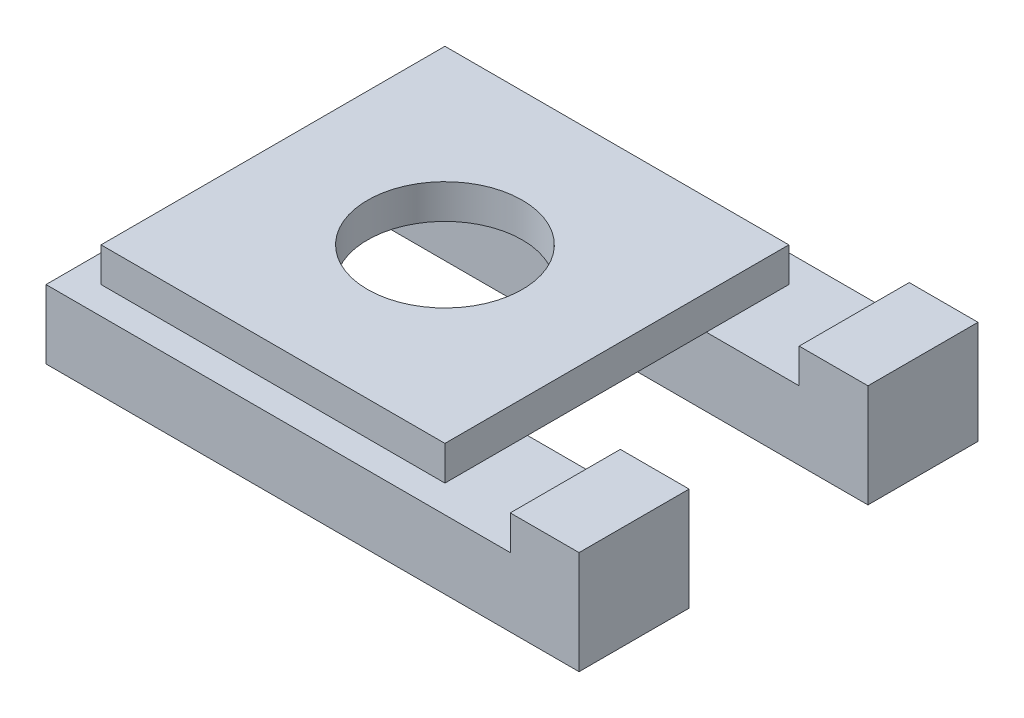
ISO-10303-21;
HEADER;
FILE_DESCRIPTION(('STEP AP214'),'2;1');
FILE_NAME('part.step','',(''),(''),'','','');
FILE_SCHEMA(('AUTOMOTIVE_DESIGN { 1 0 10303 214 1 1 1 1 }'));
ENDSEC;
DATA;
#1=APPLICATION_CONTEXT('core data for automotive mechanical design processes');
#2=APPLICATION_PROTOCOL_DEFINITION('international standard','automotive_design',2000,#1);
#3=PRODUCT_CONTEXT('',#1,'mechanical');
#4=PRODUCT('Part','Part','',(#3));
#5=PRODUCT_RELATED_PRODUCT_CATEGORY('part','',(#4));
#6=PRODUCT_DEFINITION_FORMATION('','',#4);
#7=PRODUCT_DEFINITION_CONTEXT('part definition',#1,'design');
#8=PRODUCT_DEFINITION('design','',#6,#7);
#9=PRODUCT_DEFINITION_SHAPE('','',#8);
#10=(LENGTH_UNIT() NAMED_UNIT(*) SI_UNIT(.MILLI.,.METRE.));
#11=(NAMED_UNIT(*) PLANE_ANGLE_UNIT() SI_UNIT($,.RADIAN.));
#12=(NAMED_UNIT(*) SI_UNIT($,.STERADIAN.) SOLID_ANGLE_UNIT());
#13=UNCERTAINTY_MEASURE_WITH_UNIT(LENGTH_MEASURE(1.E-05),#10,'distance_accuracy_value','');
#14=(GEOMETRIC_REPRESENTATION_CONTEXT(3) GLOBAL_UNCERTAINTY_ASSIGNED_CONTEXT((#13)) GLOBAL_UNIT_ASSIGNED_CONTEXT((#10,
#11,#12)) REPRESENTATION_CONTEXT('',''));
#15=CARTESIAN_POINT('',(0.,0.,0.));
#16=DIRECTION('',(0.,0.,1.));
#17=DIRECTION('',(1.,0.,0.));
#18=AXIS2_PLACEMENT_3D('',#15,#16,#17);
#19=CARTESIAN_POINT('',(0.,0.,0.));
#20=DIRECTION('',(0.,-1.,0.));
#21=DIRECTION('',(0.,0.,-1.));
#22=AXIS2_PLACEMENT_3D('',#19,#20,#21);
#23=PLANE('',#22);
#24=DIRECTION('',(0.,0.,1.));
#25=VECTOR('',#24,1.);
#26=CARTESIAN_POINT('',(77.,0.,0.));
#27=LINE('',#26,#25);
#28=CARTESIAN_POINT('',(77.,0.,-58.));
#29=VERTEX_POINT('',#28);
#30=CARTESIAN_POINT('',(77.,0.,-26.));
#31=VERTEX_POINT('',#30);
#32=EDGE_CURVE('E66',#29,#31,#27,.T.);
#33=ORIENTED_EDGE('',*,*,#32,.F.);
#34=DIRECTION('',(1.,0.,0.));
#35=VECTOR('',#34,1.);
#36=CARTESIAN_POINT('',(0.,0.,-58.));
#37=LINE('',#36,#35);
#38=CARTESIAN_POINT('',(-58.,0.,-58.));
#39=VERTEX_POINT('',#38);
#40=EDGE_CURVE('E251',#39,#29,#37,.T.);
#41=ORIENTED_EDGE('',*,*,#40,.F.);
#42=DIRECTION('',(0.,0.,1.));
#43=VECTOR('',#42,1.);
#44=CARTESIAN_POINT('',(-58.,0.,0.));
#45=LINE('',#44,#43);
#46=CARTESIAN_POINT('',(-58.,0.,-26.));
#47=VERTEX_POINT('',#46);
#48=EDGE_CURVE('E262',#39,#47,#45,.T.);
#49=ORIENTED_EDGE('',*,*,#48,.T.);
#50=DIRECTION('',(1.,0.,0.));
#51=VECTOR('',#50,1.);
#52=CARTESIAN_POINT('',(0.,0.,-26.));
#53=LINE('',#52,#51);
#54=CARTESIAN_POINT('',(-50.,0.,-26.));
#55=VERTEX_POINT('',#54);
#56=EDGE_CURVE('E261',#47,#55,#53,.T.);
#57=ORIENTED_EDGE('',*,*,#56,.T.);
#58=DIRECTION('',(0.,0.,1.));
#59=VECTOR('',#58,1.);
#60=CARTESIAN_POINT('',(-50.,0.,50.));
#61=LINE('',#60,#59);
#62=CARTESIAN_POINT('',(-50.,0.,-50.));
#63=VERTEX_POINT('',#62);
#64=EDGE_CURVE('E297',#63,#55,#61,.T.);
#65=ORIENTED_EDGE('',*,*,#64,.F.);
#66=DIRECTION('',(-1.,0.,0.));
#67=VECTOR('',#66,1.);
#68=CARTESIAN_POINT('',(-50.,0.,-50.));
#69=LINE('',#68,#67);
#70=CARTESIAN_POINT('',(50.,0.,-50.));
#71=VERTEX_POINT('',#70);
#72=EDGE_CURVE('E291',#71,#63,#69,.T.);
#73=ORIENTED_EDGE('',*,*,#72,.F.);
#74=DIRECTION('',(0.,0.,-1.));
#75=VECTOR('',#74,1.);
#76=CARTESIAN_POINT('',(50.,0.,50.));
#77=LINE('',#76,#75);
#78=CARTESIAN_POINT('',(50.,0.,-26.));
#79=VERTEX_POINT('',#78);
#80=EDGE_CURVE('E280',#79,#71,#77,.T.);
#81=ORIENTED_EDGE('',*,*,#80,.F.);
#82=EDGE_CURVE('E210',#79,#31,#53,.T.);
#83=ORIENTED_EDGE('',*,*,#82,.T.);
#84=EDGE_LOOP('',(#33,#41,#49,#57,#65,#73,#81,#83));
#85=FACE_BOUND('',#84,.T.);
#86=ADVANCED_FACE('F41',(#85),#23,.F.);
#87=CARTESIAN_POINT('',(0.,0.,0.));
#88=DIRECTION('',(0.,-1.,0.));
#89=DIRECTION('',(0.,0.,-1.));
#90=AXIS2_PLACEMENT_3D('',#87,#88,#89);
#91=PLANE('',#90);
#92=DIRECTION('',(1.,0.,0.));
#93=VECTOR('',#92,1.);
#94=CARTESIAN_POINT('',(0.,0.,26.));
#95=LINE('',#94,#93);
#96=CARTESIAN_POINT('',(-50.,0.,26.));
#97=VERTEX_POINT('',#96);
#98=CARTESIAN_POINT('',(50.,0.,26.));
#99=VERTEX_POINT('',#98);
#100=EDGE_CURVE('E11',#97,#99,#95,.T.);
#101=ORIENTED_EDGE('',*,*,#100,.F.);
#102=EDGE_CURVE('E303',#55,#97,#61,.T.);
#103=ORIENTED_EDGE('',*,*,#102,.F.);
#104=EDGE_CURVE('E49',#55,#79,#53,.T.);
#105=ORIENTED_EDGE('',*,*,#104,.T.);
#106=EDGE_CURVE('E294',#99,#79,#77,.T.);
#107=ORIENTED_EDGE('',*,*,#106,.F.);
#108=EDGE_LOOP('',(#101,#103,#105,#107));
#109=FACE_BOUND('',#108,.T.);
#110=CARTESIAN_POINT('',(0.,0.,0.));
#111=DIRECTION('',(0.,1.,0.));
#112=DIRECTION('',(0.,0.,1.));
#113=AXIS2_PLACEMENT_3D('',#110,#111,#112);
#114=CIRCLE('',#113,22.5);
#115=CARTESIAN_POINT('',(0.,0.,22.5));
#116=VERTEX_POINT('',#115);
#117=EDGE_CURVE('E246',#116,#116,#114,.T.);
#118=ORIENTED_EDGE('',*,*,#117,.T.);
#119=EDGE_LOOP('',(#118));
#120=FACE_BOUND('',#119,.T.);
#121=ADVANCED_FACE('F336',(#109,#120),#91,.T.);
#122=CARTESIAN_POINT('',(0.,10.,0.));
#123=DIRECTION('',(0.,-1.,0.));
#124=DIRECTION('',(0.,0.,-1.));
#125=AXIS2_PLACEMENT_3D('',#122,#123,#124);
#126=PLANE('',#125);
#127=DIRECTION('',(0.,0.,-1.));
#128=VECTOR('',#127,1.);
#129=CARTESIAN_POINT('',(50.,10.,50.));
#130=LINE('',#129,#128);
#131=CARTESIAN_POINT('',(50.,10.,50.));
#132=VERTEX_POINT('',#131);
#133=CARTESIAN_POINT('',(50.,10.,-50.));
#134=VERTEX_POINT('',#133);
#135=EDGE_CURVE('E278',#132,#134,#130,.T.);
#136=ORIENTED_EDGE('',*,*,#135,.T.);
#137=DIRECTION('',(-1.,0.,0.));
#138=VECTOR('',#137,1.);
#139=CARTESIAN_POINT('',(-50.,10.,-50.));
#140=LINE('',#139,#138);
#141=CARTESIAN_POINT('',(-50.,10.,-50.));
#142=VERTEX_POINT('',#141);
#143=EDGE_CURVE('E282',#134,#142,#140,.T.);
#144=ORIENTED_EDGE('',*,*,#143,.T.);
#145=DIRECTION('',(0.,0.,1.));
#146=VECTOR('',#145,1.);
#147=CARTESIAN_POINT('',(-50.,10.,50.));
#148=LINE('',#147,#146);
#149=CARTESIAN_POINT('',(-50.,10.,50.));
#150=VERTEX_POINT('',#149);
#151=EDGE_CURVE('E288',#142,#150,#148,.T.);
#152=ORIENTED_EDGE('',*,*,#151,.T.);
#153=DIRECTION('',(1.,0.,0.));
#154=VECTOR('',#153,1.);
#155=CARTESIAN_POINT('',(-50.,10.,50.));
#156=LINE('',#155,#154);
#157=EDGE_CURVE('E286',#150,#132,#156,.T.);
#158=ORIENTED_EDGE('',*,*,#157,.T.);
#159=EDGE_LOOP('',(#136,#144,#152,#158));
#160=FACE_BOUND('',#159,.T.);
#161=CARTESIAN_POINT('',(0.,10.,0.));
#162=DIRECTION('',(0.,1.,0.));
#163=DIRECTION('',(0.,0.,1.));
#164=AXIS2_PLACEMENT_3D('',#161,#162,#163);
#165=CIRCLE('',#164,22.5);
#166=CARTESIAN_POINT('',(0.,10.,22.5));
#167=VERTEX_POINT('',#166);
#168=EDGE_CURVE('E273',#167,#167,#165,.T.);
#169=ORIENTED_EDGE('',*,*,#168,.F.);
#170=EDGE_LOOP('',(#169));
#171=FACE_BOUND('',#170,.T.);
#172=ADVANCED_FACE('F362',(#160,#171),#126,.F.);
#173=CARTESIAN_POINT('',(50.,10.,50.));
#174=DIRECTION('',(-1.,0.,0.));
#175=DIRECTION('',(0.,0.,1.));
#176=AXIS2_PLACEMENT_3D('',#173,#174,#175);
#177=PLANE('',#176);
#178=CARTESIAN_POINT('',(50.,0.,50.));
#179=VERTEX_POINT('',#178);
#180=EDGE_CURVE('E292',#179,#99,#77,.T.);
#181=ORIENTED_EDGE('',*,*,#180,.T.);
#182=ORIENTED_EDGE('',*,*,#106,.T.);
#183=ORIENTED_EDGE('',*,*,#80,.T.);
#184=DIRECTION('',(0.,-1.,0.));
#185=VECTOR('',#184,1.);
#186=CARTESIAN_POINT('',(50.,10.,-50.));
#187=LINE('',#186,#185);
#188=EDGE_CURVE('E44',#134,#71,#187,.T.);
#189=ORIENTED_EDGE('',*,*,#188,.F.);
#190=ORIENTED_EDGE('',*,*,#135,.F.);
#191=DIRECTION('',(0.,-1.,0.));
#192=VECTOR('',#191,1.);
#193=CARTESIAN_POINT('',(50.,10.,50.));
#194=LINE('',#193,#192);
#195=EDGE_CURVE('E289',#132,#179,#194,.T.);
#196=ORIENTED_EDGE('',*,*,#195,.T.);
#197=EDGE_LOOP('',(#181,#182,#183,#189,#190,#196));
#198=FACE_BOUND('',#197,.T.);
#199=ADVANCED_FACE('F43',(#198),#177,.F.);
#200=CARTESIAN_POINT('',(-50.,10.,-50.));
#201=DIRECTION('',(0.,0.,1.));
#202=DIRECTION('',(1.,0.,0.));
#203=AXIS2_PLACEMENT_3D('',#200,#201,#202);
#204=PLANE('',#203);
#205=ORIENTED_EDGE('',*,*,#72,.T.);
#206=DIRECTION('',(0.,-1.,0.));
#207=VECTOR('',#206,1.);
#208=CARTESIAN_POINT('',(-50.,10.,-50.));
#209=LINE('',#208,#207);
#210=EDGE_CURVE('E307',#142,#63,#209,.T.);
#211=ORIENTED_EDGE('',*,*,#210,.F.);
#212=ORIENTED_EDGE('',*,*,#143,.F.);
#213=ORIENTED_EDGE('',*,*,#188,.T.);
#214=EDGE_LOOP('',(#205,#211,#212,#213));
#215=FACE_BOUND('',#214,.T.);
#216=ADVANCED_FACE('F347',(#215),#204,.F.);
#217=CARTESIAN_POINT('',(-50.,10.,50.));
#218=DIRECTION('',(1.,0.,0.));
#219=DIRECTION('',(0.,0.,-1.));
#220=AXIS2_PLACEMENT_3D('',#217,#218,#219);
#221=PLANE('',#220);
#222=ORIENTED_EDGE('',*,*,#64,.T.);
#223=ORIENTED_EDGE('',*,*,#102,.T.);
#224=CARTESIAN_POINT('',(-50.,0.,50.));
#225=VERTEX_POINT('',#224);
#226=EDGE_CURVE('E299',#97,#225,#61,.T.);
#227=ORIENTED_EDGE('',*,*,#226,.T.);
#228=DIRECTION('',(0.,-1.,0.));
#229=VECTOR('',#228,1.);
#230=CARTESIAN_POINT('',(-50.,10.,50.));
#231=LINE('',#230,#229);
#232=EDGE_CURVE('E304',#150,#225,#231,.T.);
#233=ORIENTED_EDGE('',*,*,#232,.F.);
#234=ORIENTED_EDGE('',*,*,#151,.F.);
#235=ORIENTED_EDGE('',*,*,#210,.T.);
#236=EDGE_LOOP('',(#222,#223,#227,#233,#234,#235));
#237=FACE_BOUND('',#236,.T.);
#238=ADVANCED_FACE('F341',(#237),#221,.F.);
#239=CARTESIAN_POINT('',(-50.,10.,50.));
#240=DIRECTION('',(0.,0.,-1.));
#241=DIRECTION('',(-1.,0.,0.));
#242=AXIS2_PLACEMENT_3D('',#239,#240,#241);
#243=PLANE('',#242);
#244=DIRECTION('',(1.,0.,0.));
#245=VECTOR('',#244,1.);
#246=CARTESIAN_POINT('',(-50.,0.,50.));
#247=LINE('',#246,#245);
#248=EDGE_CURVE('E285',#225,#179,#247,.T.);
#249=ORIENTED_EDGE('',*,*,#248,.T.);
#250=ORIENTED_EDGE('',*,*,#195,.F.);
#251=ORIENTED_EDGE('',*,*,#157,.F.);
#252=ORIENTED_EDGE('',*,*,#232,.T.);
#253=EDGE_LOOP('',(#249,#250,#251,#252));
#254=FACE_BOUND('',#253,.T.);
#255=ADVANCED_FACE('F344',(#254),#243,.F.);
#256=CARTESIAN_POINT('',(0.,10.,0.));
#257=DIRECTION('',(0.,-1.,0.));
#258=DIRECTION('',(0.,0.,-1.));
#259=AXIS2_PLACEMENT_3D('',#256,#257,#258);
#260=CYLINDRICAL_SURFACE('',#259,22.5);
#261=ORIENTED_EDGE('',*,*,#168,.T.);
#262=EDGE_LOOP('',(#261));
#263=FACE_BOUND('',#262,.T.);
#264=ORIENTED_EDGE('',*,*,#117,.F.);
#265=EDGE_LOOP('',(#264));
#266=FACE_BOUND('',#265,.T.);
#267=ADVANCED_FACE('F354',(#263,#266),#260,.F.);
#268=CARTESIAN_POINT('',(0.,-20.,-26.));
#269=DIRECTION('',(0.,0.,1.));
#270=DIRECTION('',(1.,0.,0.));
#271=AXIS2_PLACEMENT_3D('',#268,#269,#270);
#272=PLANE('',#271);
#273=ORIENTED_EDGE('',*,*,#56,.F.);
#274=DIRECTION('',(0.,1.,0.));
#275=VECTOR('',#274,1.);
#276=CARTESIAN_POINT('',(-58.,-20.,-26.));
#277=LINE('',#276,#275);
#278=CARTESIAN_POINT('',(-58.,-20.,-26.));
#279=VERTEX_POINT('',#278);
#280=EDGE_CURVE('E236',#279,#47,#277,.T.);
#281=ORIENTED_EDGE('',*,*,#280,.F.);
#282=DIRECTION('',(1.,0.,0.));
#283=VECTOR('',#282,1.);
#284=CARTESIAN_POINT('',(0.,-20.,-26.));
#285=LINE('',#284,#283);
#286=CARTESIAN_POINT('',(97.,-20.,-26.));
#287=VERTEX_POINT('',#286);
#288=EDGE_CURVE('E247',#279,#287,#285,.T.);
#289=ORIENTED_EDGE('',*,*,#288,.T.);
#290=DIRECTION('',(0.,1.,0.));
#291=VECTOR('',#290,1.);
#292=CARTESIAN_POINT('',(97.,-20.,-26.));
#293=LINE('',#292,#291);
#294=CARTESIAN_POINT('',(97.,10.,-26.));
#295=VERTEX_POINT('',#294);
#296=EDGE_CURVE('E257',#287,#295,#293,.T.);
#297=ORIENTED_EDGE('',*,*,#296,.T.);
#298=DIRECTION('',(1.,0.,0.));
#299=VECTOR('',#298,1.);
#300=CARTESIAN_POINT('',(0.,10.,-26.));
#301=LINE('',#300,#299);
#302=CARTESIAN_POINT('',(77.,10.,-26.));
#303=VERTEX_POINT('',#302);
#304=EDGE_CURVE('E217',#303,#295,#301,.T.);
#305=ORIENTED_EDGE('',*,*,#304,.F.);
#306=DIRECTION('',(0.,-1.,0.));
#307=VECTOR('',#306,1.);
#308=CARTESIAN_POINT('',(77.,10.,-26.));
#309=LINE('',#308,#307);
#310=EDGE_CURVE('E200',#303,#31,#309,.T.);
#311=ORIENTED_EDGE('',*,*,#310,.T.);
#312=ORIENTED_EDGE('',*,*,#82,.F.);
#313=ORIENTED_EDGE('',*,*,#104,.F.);
#314=EDGE_LOOP('',(#273,#281,#289,#297,#305,#311,#312,#313));
#315=FACE_BOUND('',#314,.T.);
#316=ADVANCED_FACE('F324',(#315),#272,.T.);
#317=CARTESIAN_POINT('',(-58.,-20.,0.));
#318=DIRECTION('',(-1.,0.,0.));
#319=DIRECTION('',(0.,0.,1.));
#320=AXIS2_PLACEMENT_3D('',#317,#318,#319);
#321=PLANE('',#320);
#322=ORIENTED_EDGE('',*,*,#48,.F.);
#323=DIRECTION('',(0.,1.,0.));
#324=VECTOR('',#323,1.);
#325=CARTESIAN_POINT('',(-58.,-20.,-58.));
#326=LINE('',#325,#324);
#327=CARTESIAN_POINT('',(-58.,-20.,-58.));
#328=VERTEX_POINT('',#327);
#329=EDGE_CURVE('E271',#328,#39,#326,.T.);
#330=ORIENTED_EDGE('',*,*,#329,.F.);
#331=DIRECTION('',(0.,0.,1.));
#332=VECTOR('',#331,1.);
#333=CARTESIAN_POINT('',(-58.,-20.,0.));
#334=LINE('',#333,#332);
#335=EDGE_CURVE('E252',#328,#279,#334,.T.);
#336=ORIENTED_EDGE('',*,*,#335,.T.);
#337=ORIENTED_EDGE('',*,*,#280,.T.);
#338=EDGE_LOOP('',(#322,#330,#336,#337));
#339=FACE_BOUND('',#338,.T.);
#340=ADVANCED_FACE('F338',(#339),#321,.T.);
#341=CARTESIAN_POINT('',(0.,-20.,-58.));
#342=DIRECTION('',(0.,0.,1.));
#343=DIRECTION('',(1.,0.,0.));
#344=AXIS2_PLACEMENT_3D('',#341,#342,#343);
#345=PLANE('',#344);
#346=ORIENTED_EDGE('',*,*,#40,.T.);
#347=DIRECTION('',(0.,-1.,0.));
#348=VECTOR('',#347,1.);
#349=CARTESIAN_POINT('',(77.,10.,-58.));
#350=LINE('',#349,#348);
#351=CARTESIAN_POINT('',(77.,10.,-58.));
#352=VERTEX_POINT('',#351);
#353=EDGE_CURVE('E222',#352,#29,#350,.T.);
#354=ORIENTED_EDGE('',*,*,#353,.F.);
#355=DIRECTION('',(1.,0.,0.));
#356=VECTOR('',#355,1.);
#357=CARTESIAN_POINT('',(0.,10.,-58.));
#358=LINE('',#357,#356);
#359=CARTESIAN_POINT('',(97.,10.,-58.));
#360=VERTEX_POINT('',#359);
#361=EDGE_CURVE('E215',#352,#360,#358,.T.);
#362=ORIENTED_EDGE('',*,*,#361,.T.);
#363=DIRECTION('',(0.,1.,0.));
#364=VECTOR('',#363,1.);
#365=CARTESIAN_POINT('',(97.,-20.,-58.));
#366=LINE('',#365,#364);
#367=CARTESIAN_POINT('',(97.,-20.,-58.));
#368=VERTEX_POINT('',#367);
#369=EDGE_CURVE('E267',#368,#360,#366,.T.);
#370=ORIENTED_EDGE('',*,*,#369,.F.);
#371=DIRECTION('',(1.,0.,0.));
#372=VECTOR('',#371,1.);
#373=CARTESIAN_POINT('',(0.,-20.,-58.));
#374=LINE('',#373,#372);
#375=EDGE_CURVE('E258',#328,#368,#374,.T.);
#376=ORIENTED_EDGE('',*,*,#375,.F.);
#377=ORIENTED_EDGE('',*,*,#329,.T.);
#378=EDGE_LOOP('',(#346,#354,#362,#370,#376,#377));
#379=FACE_BOUND('',#378,.T.);
#380=ADVANCED_FACE('F332',(#379),#345,.F.);
#381=CARTESIAN_POINT('',(97.,-20.,0.));
#382=DIRECTION('',(-1.,0.,0.));
#383=DIRECTION('',(0.,0.,1.));
#384=AXIS2_PLACEMENT_3D('',#381,#382,#383);
#385=PLANE('',#384);
#386=ORIENTED_EDGE('',*,*,#369,.T.);
#387=DIRECTION('',(0.,0.,1.));
#388=VECTOR('',#387,1.);
#389=CARTESIAN_POINT('',(97.,10.,0.));
#390=LINE('',#389,#388);
#391=EDGE_CURVE('E214',#360,#295,#390,.T.);
#392=ORIENTED_EDGE('',*,*,#391,.T.);
#393=ORIENTED_EDGE('',*,*,#296,.F.);
#394=DIRECTION('',(0.,0.,1.));
#395=VECTOR('',#394,1.);
#396=CARTESIAN_POINT('',(97.,-20.,0.));
#397=LINE('',#396,#395);
#398=EDGE_CURVE('E256',#368,#287,#397,.T.);
#399=ORIENTED_EDGE('',*,*,#398,.F.);
#400=EDGE_LOOP('',(#386,#392,#393,#399));
#401=FACE_BOUND('',#400,.T.);
#402=ADVANCED_FACE('F366',(#401),#385,.F.);
#403=CARTESIAN_POINT('',(0.,-20.,0.));
#404=DIRECTION('',(0.,-1.,0.));
#405=DIRECTION('',(0.,0.,-1.));
#406=AXIS2_PLACEMENT_3D('',#403,#404,#405);
#407=PLANE('',#406);
#408=ORIENTED_EDGE('',*,*,#288,.F.);
#409=ORIENTED_EDGE('',*,*,#335,.F.);
#410=ORIENTED_EDGE('',*,*,#375,.T.);
#411=ORIENTED_EDGE('',*,*,#398,.T.);
#412=EDGE_LOOP('',(#408,#409,#410,#411));
#413=FACE_BOUND('',#412,.T.);
#414=ADVANCED_FACE('F368',(#413),#407,.T.);
#415=CARTESIAN_POINT('',(-58.,-20.,0.));
#416=DIRECTION('',(1.,0.,0.));
#417=DIRECTION('',(0.,0.,-1.));
#418=AXIS2_PLACEMENT_3D('',#415,#416,#417);
#419=PLANE('',#418);
#420=DIRECTION('',(0.,0.,-1.));
#421=VECTOR('',#420,1.);
#422=CARTESIAN_POINT('',(-58.,0.,0.));
#423=LINE('',#422,#421);
#424=CARTESIAN_POINT('',(-58.,0.,58.));
#425=VERTEX_POINT('',#424);
#426=CARTESIAN_POINT('',(-58.,0.,26.));
#427=VERTEX_POINT('',#426);
#428=EDGE_CURVE('E237',#425,#427,#423,.T.);
#429=ORIENTED_EDGE('',*,*,#428,.T.);
#430=DIRECTION('',(0.,1.,0.));
#431=VECTOR('',#430,1.);
#432=CARTESIAN_POINT('',(-58.,-20.,26.));
#433=LINE('',#432,#431);
#434=CARTESIAN_POINT('',(-58.,-20.,26.));
#435=VERTEX_POINT('',#434);
#436=EDGE_CURVE('E241',#435,#427,#433,.T.);
#437=ORIENTED_EDGE('',*,*,#436,.F.);
#438=DIRECTION('',(0.,0.,-1.));
#439=VECTOR('',#438,1.);
#440=CARTESIAN_POINT('',(-58.,-20.,0.));
#441=LINE('',#440,#439);
#442=CARTESIAN_POINT('',(-58.,-20.,58.));
#443=VERTEX_POINT('',#442);
#444=EDGE_CURVE('E229',#443,#435,#441,.T.);
#445=ORIENTED_EDGE('',*,*,#444,.F.);
#446=DIRECTION('',(0.,1.,0.));
#447=VECTOR('',#446,1.);
#448=CARTESIAN_POINT('',(-58.,-20.,58.));
#449=LINE('',#448,#447);
#450=EDGE_CURVE('E183',#443,#425,#449,.T.);
#451=ORIENTED_EDGE('',*,*,#450,.T.);
#452=EDGE_LOOP('',(#429,#437,#445,#451));
#453=FACE_BOUND('',#452,.T.);
#454=ADVANCED_FACE('F429',(#453),#419,.F.);
#455=CARTESIAN_POINT('',(0.,-20.,26.));
#456=DIRECTION('',(0.,0.,1.));
#457=DIRECTION('',(1.,0.,0.));
#458=AXIS2_PLACEMENT_3D('',#455,#456,#457);
#459=PLANE('',#458);
#460=EDGE_CURVE('E55',#427,#97,#95,.T.);
#461=ORIENTED_EDGE('',*,*,#460,.T.);
#462=ORIENTED_EDGE('',*,*,#100,.T.);
#463=CARTESIAN_POINT('',(77.,0.,26.));
#464=VERTEX_POINT('',#463);
#465=EDGE_CURVE('E52',#99,#464,#95,.T.);
#466=ORIENTED_EDGE('',*,*,#465,.T.);
#467=DIRECTION('',(0.,-1.,0.));
#468=VECTOR('',#467,1.);
#469=CARTESIAN_POINT('',(77.,10.,26.));
#470=LINE('',#469,#468);
#471=CARTESIAN_POINT('',(77.,10.,26.));
#472=VERTEX_POINT('',#471);
#473=EDGE_CURVE('E58',#472,#464,#470,.T.);
#474=ORIENTED_EDGE('',*,*,#473,.F.);
#475=DIRECTION('',(1.,0.,0.));
#476=VECTOR('',#475,1.);
#477=CARTESIAN_POINT('',(0.,10.,26.));
#478=LINE('',#477,#476);
#479=CARTESIAN_POINT('',(97.,10.,26.));
#480=VERTEX_POINT('',#479);
#481=EDGE_CURVE('E201',#472,#480,#478,.T.);
#482=ORIENTED_EDGE('',*,*,#481,.T.);
#483=DIRECTION('',(0.,1.,0.));
#484=VECTOR('',#483,1.);
#485=CARTESIAN_POINT('',(97.,-20.,26.));
#486=LINE('',#485,#484);
#487=CARTESIAN_POINT('',(97.,-20.,26.));
#488=VERTEX_POINT('',#487);
#489=EDGE_CURVE('E184',#488,#480,#486,.T.);
#490=ORIENTED_EDGE('',*,*,#489,.F.);
#491=DIRECTION('',(1.,0.,0.));
#492=VECTOR('',#491,1.);
#493=CARTESIAN_POINT('',(0.,-20.,26.));
#494=LINE('',#493,#492);
#495=EDGE_CURVE('E226',#435,#488,#494,.T.);
#496=ORIENTED_EDGE('',*,*,#495,.F.);
#497=ORIENTED_EDGE('',*,*,#436,.T.);
#498=EDGE_LOOP('',(#461,#462,#466,#474,#482,#490,#496,#497));
#499=FACE_BOUND('',#498,.T.);
#500=ADVANCED_FACE('F399',(#499),#459,.F.);
#501=CARTESIAN_POINT('',(97.,-20.,0.));
#502=DIRECTION('',(1.,0.,0.));
#503=DIRECTION('',(0.,0.,-1.));
#504=AXIS2_PLACEMENT_3D('',#501,#502,#503);
#505=PLANE('',#504);
#506=ORIENTED_EDGE('',*,*,#489,.T.);
#507=DIRECTION('',(0.,0.,-1.));
#508=VECTOR('',#507,1.);
#509=CARTESIAN_POINT('',(97.,10.,0.));
#510=LINE('',#509,#508);
#511=CARTESIAN_POINT('',(97.,10.,58.));
#512=VERTEX_POINT('',#511);
#513=EDGE_CURVE('E193',#512,#480,#510,.T.);
#514=ORIENTED_EDGE('',*,*,#513,.F.);
#515=DIRECTION('',(0.,1.,0.));
#516=VECTOR('',#515,1.);
#517=CARTESIAN_POINT('',(97.,-20.,58.));
#518=LINE('',#517,#516);
#519=CARTESIAN_POINT('',(97.,-20.,58.));
#520=VERTEX_POINT('',#519);
#521=EDGE_CURVE('E174',#520,#512,#518,.T.);
#522=ORIENTED_EDGE('',*,*,#521,.F.);
#523=DIRECTION('',(0.,0.,-1.));
#524=VECTOR('',#523,1.);
#525=CARTESIAN_POINT('',(97.,-20.,0.));
#526=LINE('',#525,#524);
#527=EDGE_CURVE('E231',#520,#488,#526,.T.);
#528=ORIENTED_EDGE('',*,*,#527,.T.);
#529=EDGE_LOOP('',(#506,#514,#522,#528));
#530=FACE_BOUND('',#529,.T.);
#531=ADVANCED_FACE('F194',(#530),#505,.T.);
#532=CARTESIAN_POINT('',(0.,-20.,58.));
#533=DIRECTION('',(0.,0.,1.));
#534=DIRECTION('',(1.,0.,0.));
#535=AXIS2_PLACEMENT_3D('',#532,#533,#534);
#536=PLANE('',#535);
#537=DIRECTION('',(1.,0.,0.));
#538=VECTOR('',#537,1.);
#539=CARTESIAN_POINT('',(0.,0.,58.));
#540=LINE('',#539,#538);
#541=CARTESIAN_POINT('',(77.,0.,58.));
#542=VERTEX_POINT('',#541);
#543=EDGE_CURVE('E233',#425,#542,#540,.T.);
#544=ORIENTED_EDGE('',*,*,#543,.F.);
#545=ORIENTED_EDGE('',*,*,#450,.F.);
#546=DIRECTION('',(1.,0.,0.));
#547=VECTOR('',#546,1.);
#548=CARTESIAN_POINT('',(0.,-20.,58.));
#549=LINE('',#548,#547);
#550=EDGE_CURVE('E177',#443,#520,#549,.T.);
#551=ORIENTED_EDGE('',*,*,#550,.T.);
#552=ORIENTED_EDGE('',*,*,#521,.T.);
#553=DIRECTION('',(1.,0.,0.));
#554=VECTOR('',#553,1.);
#555=CARTESIAN_POINT('',(0.,10.,58.));
#556=LINE('',#555,#554);
#557=CARTESIAN_POINT('',(77.,10.,58.));
#558=VERTEX_POINT('',#557);
#559=EDGE_CURVE('E178',#558,#512,#556,.T.);
#560=ORIENTED_EDGE('',*,*,#559,.F.);
#561=DIRECTION('',(0.,-1.,0.));
#562=VECTOR('',#561,1.);
#563=CARTESIAN_POINT('',(77.,10.,58.));
#564=LINE('',#563,#562);
#565=EDGE_CURVE('E204',#558,#542,#564,.T.);
#566=ORIENTED_EDGE('',*,*,#565,.T.);
#567=EDGE_LOOP('',(#544,#545,#551,#552,#560,#566));
#568=FACE_BOUND('',#567,.T.);
#569=ADVANCED_FACE('F171',(#568),#536,.T.);
#570=CARTESIAN_POINT('',(0.,-20.,0.));
#571=DIRECTION('',(0.,-1.,0.));
#572=DIRECTION('',(0.,0.,-1.));
#573=AXIS2_PLACEMENT_3D('',#570,#571,#572);
#574=PLANE('',#573);
#575=ORIENTED_EDGE('',*,*,#444,.T.);
#576=ORIENTED_EDGE('',*,*,#495,.T.);
#577=ORIENTED_EDGE('',*,*,#527,.F.);
#578=ORIENTED_EDGE('',*,*,#550,.F.);
#579=EDGE_LOOP('',(#575,#576,#577,#578));
#580=FACE_BOUND('',#579,.T.);
#581=ADVANCED_FACE('F412',(#580),#574,.T.);
#582=CARTESIAN_POINT('',(0.,0.,0.));
#583=DIRECTION('',(0.,-1.,0.));
#584=DIRECTION('',(0.,0.,-1.));
#585=AXIS2_PLACEMENT_3D('',#582,#583,#584);
#586=PLANE('',#585);
#587=ORIENTED_EDGE('',*,*,#543,.T.);
#588=DIRECTION('',(0.,0.,-1.));
#589=VECTOR('',#588,1.);
#590=CARTESIAN_POINT('',(77.,0.,0.));
#591=LINE('',#590,#589);
#592=EDGE_CURVE('E197',#542,#464,#591,.T.);
#593=ORIENTED_EDGE('',*,*,#592,.T.);
#594=ORIENTED_EDGE('',*,*,#465,.F.);
#595=ORIENTED_EDGE('',*,*,#180,.F.);
#596=ORIENTED_EDGE('',*,*,#248,.F.);
#597=ORIENTED_EDGE('',*,*,#226,.F.);
#598=ORIENTED_EDGE('',*,*,#460,.F.);
#599=ORIENTED_EDGE('',*,*,#428,.F.);
#600=EDGE_LOOP('',(#587,#593,#594,#595,#596,#597,#598,#599));
#601=FACE_BOUND('',#600,.T.);
#602=ADVANCED_FACE('F400',(#601),#586,.F.);
#603=CARTESIAN_POINT('',(77.,10.,0.));
#604=DIRECTION('',(-1.,0.,0.));
#605=DIRECTION('',(0.,0.,1.));
#606=AXIS2_PLACEMENT_3D('',#603,#604,#605);
#607=PLANE('',#606);
#608=ORIENTED_EDGE('',*,*,#592,.F.);
#609=ORIENTED_EDGE('',*,*,#565,.F.);
#610=DIRECTION('',(0.,0.,-1.));
#611=VECTOR('',#610,1.);
#612=CARTESIAN_POINT('',(77.,10.,0.));
#613=LINE('',#612,#611);
#614=EDGE_CURVE('E191',#558,#472,#613,.T.);
#615=ORIENTED_EDGE('',*,*,#614,.T.);
#616=ORIENTED_EDGE('',*,*,#473,.T.);
#617=EDGE_LOOP('',(#608,#609,#615,#616));
#618=FACE_BOUND('',#617,.T.);
#619=ADVANCED_FACE('F408',(#618),#607,.T.);
#620=CARTESIAN_POINT('',(0.,10.,0.));
#621=DIRECTION('',(0.,-1.,0.));
#622=DIRECTION('',(0.,0.,-1.));
#623=AXIS2_PLACEMENT_3D('',#620,#621,#622);
#624=PLANE('',#623);
#625=ORIENTED_EDGE('',*,*,#513,.T.);
#626=ORIENTED_EDGE('',*,*,#481,.F.);
#627=ORIENTED_EDGE('',*,*,#614,.F.);
#628=ORIENTED_EDGE('',*,*,#559,.T.);
#629=EDGE_LOOP('',(#625,#626,#627,#628));
#630=FACE_BOUND('',#629,.T.);
#631=ADVANCED_FACE('F190',(#630),#624,.F.);
#632=CARTESIAN_POINT('',(77.,10.,0.));
#633=DIRECTION('',(1.,0.,0.));
#634=DIRECTION('',(0.,0.,-1.));
#635=AXIS2_PLACEMENT_3D('',#632,#633,#634);
#636=PLANE('',#635);
#637=ORIENTED_EDGE('',*,*,#32,.T.);
#638=ORIENTED_EDGE('',*,*,#310,.F.);
#639=DIRECTION('',(0.,0.,1.));
#640=VECTOR('',#639,1.);
#641=CARTESIAN_POINT('',(77.,10.,0.));
#642=LINE('',#641,#640);
#643=EDGE_CURVE('E207',#352,#303,#642,.T.);
#644=ORIENTED_EDGE('',*,*,#643,.F.);
#645=ORIENTED_EDGE('',*,*,#353,.T.);
#646=EDGE_LOOP('',(#637,#638,#644,#645));
#647=FACE_BOUND('',#646,.T.);
#648=ADVANCED_FACE('F327',(#647),#636,.F.);
#649=CARTESIAN_POINT('',(0.,10.,0.));
#650=DIRECTION('',(0.,-1.,0.));
#651=DIRECTION('',(0.,0.,-1.));
#652=AXIS2_PLACEMENT_3D('',#649,#650,#651);
#653=PLANE('',#652);
#654=ORIENTED_EDGE('',*,*,#643,.T.);
#655=ORIENTED_EDGE('',*,*,#304,.T.);
#656=ORIENTED_EDGE('',*,*,#391,.F.);
#657=ORIENTED_EDGE('',*,*,#361,.F.);
#658=EDGE_LOOP('',(#654,#655,#656,#657));
#659=FACE_BOUND('',#658,.T.);
#660=ADVANCED_FACE('F417',(#659),#653,.F.);
#661=CLOSED_SHELL('',(#86,#121,#172,#199,#216,#238,#255,#267,#316,#340,#380,#402,#414,#454,#500,
#531,#569,#581,#602,#619,#631,#648,#660));
#662=MANIFOLD_SOLID_BREP('B2',#661);
#663=ADVANCED_BREP_SHAPE_REPRESENTATION('',(#18,#662),#14);
#664=SHAPE_DEFINITION_REPRESENTATION(#9,#663);
ENDSEC;
END-ISO-10303-21;
